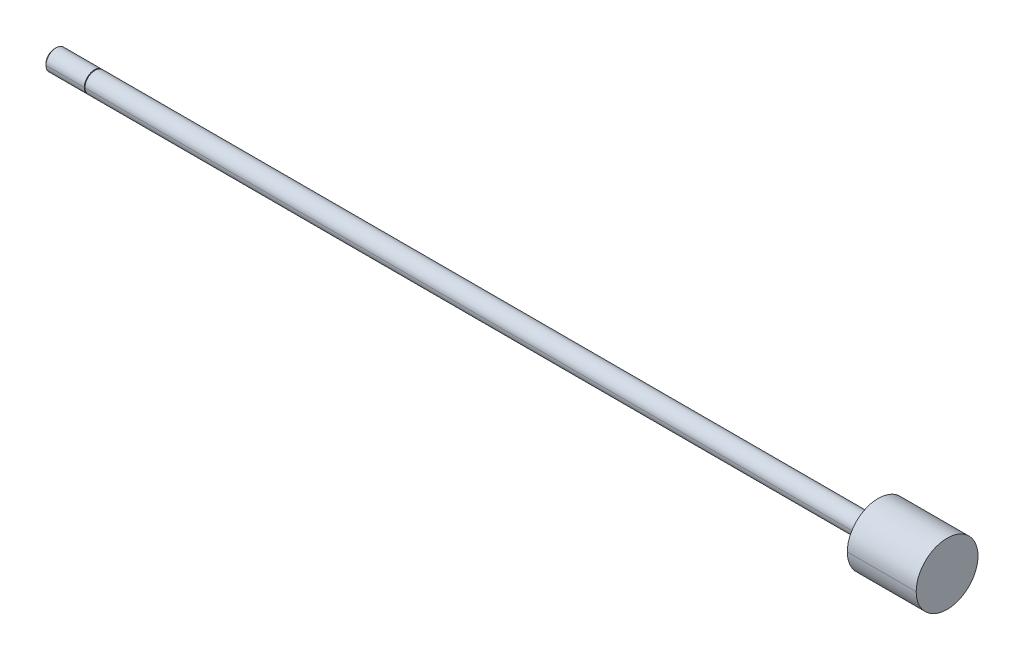
ISO-10303-21;
HEADER;
FILE_DESCRIPTION(('STEP AP214'),'2;1');
FILE_NAME('part.step','',(''),(''),'','','');
FILE_SCHEMA(('AUTOMOTIVE_DESIGN { 1 0 10303 214 1 1 1 1 }'));
ENDSEC;
DATA;
#1=APPLICATION_CONTEXT('core data for automotive mechanical design processes');
#2=APPLICATION_PROTOCOL_DEFINITION('international standard','automotive_design',2000,#1);
#3=PRODUCT_CONTEXT('',#1,'mechanical');
#4=PRODUCT('Part','Part','',(#3));
#5=PRODUCT_RELATED_PRODUCT_CATEGORY('part','',(#4));
#6=PRODUCT_DEFINITION_FORMATION('','',#4);
#7=PRODUCT_DEFINITION_CONTEXT('part definition',#1,'design');
#8=PRODUCT_DEFINITION('design','',#6,#7);
#9=PRODUCT_DEFINITION_SHAPE('','',#8);
#10=(LENGTH_UNIT() NAMED_UNIT(*) SI_UNIT(.MILLI.,.METRE.));
#11=(NAMED_UNIT(*) PLANE_ANGLE_UNIT() SI_UNIT($,.RADIAN.));
#12=(NAMED_UNIT(*) SI_UNIT($,.STERADIAN.) SOLID_ANGLE_UNIT());
#13=UNCERTAINTY_MEASURE_WITH_UNIT(LENGTH_MEASURE(1.E-05),#10,'distance_accuracy_value','');
#14=(GEOMETRIC_REPRESENTATION_CONTEXT(3) GLOBAL_UNCERTAINTY_ASSIGNED_CONTEXT((#13)) GLOBAL_UNIT_ASSIGNED_CONTEXT((#10,
#11,#12)) REPRESENTATION_CONTEXT('',''));
#15=CARTESIAN_POINT('',(0.,0.,0.));
#16=DIRECTION('',(0.,0.,1.));
#17=DIRECTION('',(1.,0.,0.));
#18=AXIS2_PLACEMENT_3D('',#15,#16,#17);
#19=CARTESIAN_POINT('',(0.,0.,0.));
#20=DIRECTION('',(-1.,0.,0.));
#21=DIRECTION('',(0.,-1.,0.));
#22=AXIS2_PLACEMENT_3D('',#19,#20,#21);
#23=CYLINDRICAL_SURFACE('',#22,2.921);
#24=CARTESIAN_POINT('',(0.,0.,0.));
#25=DIRECTION('',(1.,0.,0.));
#26=DIRECTION('',(0.,0.,-1.));
#27=AXIS2_PLACEMENT_3D('',#24,#25,#26);
#28=CIRCLE('',#27,2.921);
#29=CARTESIAN_POINT('',(0.,0.,-2.921));
#30=VERTEX_POINT('',#29);
#31=CARTESIAN_POINT('',(0.,0.,2.921));
#32=VERTEX_POINT('',#31);
#33=EDGE_CURVE('E11',#30,#32,#28,.T.);
#34=ORIENTED_EDGE('',*,*,#33,.F.);
#35=DIRECTION('',(-1.,0.,0.));
#36=VECTOR('',#35,1.);
#37=CARTESIAN_POINT('',(0.,0.,-2.921));
#38=LINE('',#37,#36);
#39=CARTESIAN_POINT('',(-0.254,0.,-2.921));
#40=VERTEX_POINT('',#39);
#41=EDGE_CURVE('E25',#30,#40,#38,.T.);
#42=ORIENTED_EDGE('',*,*,#41,.T.);
#43=CARTESIAN_POINT('',(-0.254,0.,0.));
#44=DIRECTION('',(1.,0.,0.));
#45=DIRECTION('',(0.,0.,-1.));
#46=AXIS2_PLACEMENT_3D('',#43,#44,#45);
#47=CIRCLE('',#46,2.921);
#48=CARTESIAN_POINT('',(-0.254,0.,2.921));
#49=VERTEX_POINT('',#48);
#50=EDGE_CURVE('E211',#40,#49,#47,.T.);
#51=ORIENTED_EDGE('',*,*,#50,.T.);
#52=DIRECTION('',(-1.,0.,0.));
#53=VECTOR('',#52,1.);
#54=CARTESIAN_POINT('',(0.,0.,2.921));
#55=LINE('',#54,#53);
#56=EDGE_CURVE('E206',#32,#49,#55,.T.);
#57=ORIENTED_EDGE('',*,*,#56,.F.);
#58=EDGE_LOOP('',(#34,#42,#51,#57));
#59=FACE_BOUND('',#58,.T.);
#60=ADVANCED_FACE('F17',(#59),#23,.T.);
#61=CARTESIAN_POINT('',(0.,0.,0.));
#62=DIRECTION('',(-1.,0.,0.));
#63=DIRECTION('',(0.,1.,0.));
#64=AXIS2_PLACEMENT_3D('',#61,#62,#63);
#65=CYLINDRICAL_SURFACE('',#64,2.921);
#66=CARTESIAN_POINT('',(-0.254,0.,0.));
#67=DIRECTION('',(1.,0.,0.));
#68=DIRECTION('',(0.,0.,-1.));
#69=AXIS2_PLACEMENT_3D('',#66,#67,#68);
#70=CIRCLE('',#69,2.921);
#71=EDGE_CURVE('E202',#49,#40,#70,.T.);
#72=ORIENTED_EDGE('',*,*,#71,.T.);
#73=ORIENTED_EDGE('',*,*,#41,.F.);
#74=CARTESIAN_POINT('',(0.,0.,0.));
#75=DIRECTION('',(1.,0.,0.));
#76=DIRECTION('',(0.,0.,-1.));
#77=AXIS2_PLACEMENT_3D('',#74,#75,#76);
#78=CIRCLE('',#77,2.921);
#79=EDGE_CURVE('E197',#32,#30,#78,.T.);
#80=ORIENTED_EDGE('',*,*,#79,.F.);
#81=ORIENTED_EDGE('',*,*,#56,.T.);
#82=EDGE_LOOP('',(#72,#73,#80,#81));
#83=FACE_BOUND('',#82,.T.);
#84=ADVANCED_FACE('F224',(#83),#65,.T.);
#85=CARTESIAN_POINT('',(0.,2.921,0.));
#86=DIRECTION('',(1.,0.,0.));
#87=DIRECTION('',(0.,0.,-1.));
#88=AXIS2_PLACEMENT_3D('',#85,#86,#87);
#89=PLANE('',#88);
#90=CARTESIAN_POINT('',(0.,0.,0.));
#91=DIRECTION('',(1.,0.,0.));
#92=DIRECTION('',(0.,0.,-1.));
#93=AXIS2_PLACEMENT_3D('',#90,#91,#92);
#94=CIRCLE('',#93,3.175);
#95=CARTESIAN_POINT('',(0.,0.,-3.175));
#96=VERTEX_POINT('',#95);
#97=CARTESIAN_POINT('',(0.,0.,3.175));
#98=VERTEX_POINT('',#97);
#99=EDGE_CURVE('E192',#96,#98,#94,.T.);
#100=ORIENTED_EDGE('',*,*,#99,.F.);
#101=CARTESIAN_POINT('',(0.,0.,0.));
#102=DIRECTION('',(1.,0.,0.));
#103=DIRECTION('',(0.,0.,-1.));
#104=AXIS2_PLACEMENT_3D('',#101,#102,#103);
#105=CIRCLE('',#104,3.175);
#106=EDGE_CURVE('E187',#98,#96,#105,.T.);
#107=ORIENTED_EDGE('',*,*,#106,.F.);
#108=EDGE_LOOP('',(#100,#107));
#109=FACE_BOUND('',#108,.T.);
#110=ORIENTED_EDGE('',*,*,#33,.T.);
#111=ORIENTED_EDGE('',*,*,#79,.T.);
#112=EDGE_LOOP('',(#110,#111));
#113=FACE_BOUND('',#112,.T.);
#114=ADVANCED_FACE('F249',(#109,#113),#89,.F.);
#115=CARTESIAN_POINT('',(265.1252,0.,0.));
#116=DIRECTION('',(-1.,0.,0.));
#117=DIRECTION('',(0.,1.,0.));
#118=AXIS2_PLACEMENT_3D('',#115,#116,#117);
#119=CYLINDRICAL_SURFACE('',#118,3.175);
#120=ORIENTED_EDGE('',*,*,#106,.T.);
#121=DIRECTION('',(-1.,0.,0.));
#122=VECTOR('',#121,1.);
#123=CARTESIAN_POINT('',(243.6876,0.,-3.175));
#124=LINE('',#123,#122);
#125=CARTESIAN_POINT('',(243.6876,0.,-3.175));
#126=VERTEX_POINT('',#125);
#127=EDGE_CURVE('E182',#126,#96,#124,.T.);
#128=ORIENTED_EDGE('',*,*,#127,.F.);
#129=CARTESIAN_POINT('',(243.6876,0.,0.));
#130=DIRECTION('',(1.,0.,0.));
#131=DIRECTION('',(0.,0.,-1.));
#132=AXIS2_PLACEMENT_3D('',#129,#130,#131);
#133=CIRCLE('',#132,3.175);
#134=CARTESIAN_POINT('',(243.6876,0.,3.175));
#135=VERTEX_POINT('',#134);
#136=EDGE_CURVE('E177',#135,#126,#133,.T.);
#137=ORIENTED_EDGE('',*,*,#136,.F.);
#138=DIRECTION('',(-1.,0.,0.));
#139=VECTOR('',#138,1.);
#140=CARTESIAN_POINT('',(243.6876,0.,3.175));
#141=LINE('',#140,#139);
#142=EDGE_CURVE('E172',#135,#98,#141,.T.);
#143=ORIENTED_EDGE('',*,*,#142,.T.);
#144=EDGE_LOOP('',(#120,#128,#137,#143));
#145=FACE_BOUND('',#144,.T.);
#146=ADVANCED_FACE('F253',(#145),#119,.T.);
#147=CARTESIAN_POINT('',(265.1252,0.,0.));
#148=DIRECTION('',(-1.,0.,0.));
#149=DIRECTION('',(0.,-1.,0.));
#150=AXIS2_PLACEMENT_3D('',#147,#148,#149);
#151=CYLINDRICAL_SURFACE('',#150,3.175);
#152=CARTESIAN_POINT('',(243.6876,0.,0.));
#153=DIRECTION('',(1.,0.,0.));
#154=DIRECTION('',(0.,0.,-1.));
#155=AXIS2_PLACEMENT_3D('',#152,#153,#154);
#156=CIRCLE('',#155,3.175);
#157=EDGE_CURVE('E167',#126,#135,#156,.T.);
#158=ORIENTED_EDGE('',*,*,#157,.F.);
#159=ORIENTED_EDGE('',*,*,#127,.T.);
#160=ORIENTED_EDGE('',*,*,#99,.T.);
#161=ORIENTED_EDGE('',*,*,#142,.F.);
#162=EDGE_LOOP('',(#158,#159,#160,#161));
#163=FACE_BOUND('',#162,.T.);
#164=ADVANCED_FACE('F259',(#163),#151,.T.);
#165=CARTESIAN_POINT('',(243.6876,3.175,0.));
#166=DIRECTION('',(1.,0.,0.));
#167=DIRECTION('',(0.,0.,-1.));
#168=AXIS2_PLACEMENT_3D('',#165,#166,#167);
#169=PLANE('',#168);
#170=CARTESIAN_POINT('',(243.6876,0.,0.));
#171=DIRECTION('',(1.,0.,0.));
#172=DIRECTION('',(0.,0.,-1.));
#173=AXIS2_PLACEMENT_3D('',#170,#171,#172);
#174=CIRCLE('',#173,9.62025);
#175=CARTESIAN_POINT('',(243.6876,0.,-9.62025));
#176=VERTEX_POINT('',#175);
#177=CARTESIAN_POINT('',(243.6876,0.,9.62025));
#178=VERTEX_POINT('',#177);
#179=EDGE_CURVE('E162',#176,#178,#174,.T.);
#180=ORIENTED_EDGE('',*,*,#179,.F.);
#181=CARTESIAN_POINT('',(243.6876,0.,0.));
#182=DIRECTION('',(1.,0.,0.));
#183=DIRECTION('',(0.,0.,-1.));
#184=AXIS2_PLACEMENT_3D('',#181,#182,#183);
#185=CIRCLE('',#184,9.62025);
#186=EDGE_CURVE('E157',#178,#176,#185,.T.);
#187=ORIENTED_EDGE('',*,*,#186,.F.);
#188=EDGE_LOOP('',(#180,#187));
#189=FACE_BOUND('',#188,.T.);
#190=ORIENTED_EDGE('',*,*,#157,.T.);
#191=ORIENTED_EDGE('',*,*,#136,.T.);
#192=EDGE_LOOP('',(#190,#191));
#193=FACE_BOUND('',#192,.T.);
#194=ADVANCED_FACE('F263',(#189,#193),#169,.F.);
#195=CARTESIAN_POINT('',(265.1252,0.,0.));
#196=DIRECTION('',(-1.,0.,0.));
#197=DIRECTION('',(0.,1.,0.));
#198=AXIS2_PLACEMENT_3D('',#195,#196,#197);
#199=CYLINDRICAL_SURFACE('',#198,9.62025);
#200=ORIENTED_EDGE('',*,*,#186,.T.);
#201=DIRECTION('',(-1.,0.,0.));
#202=VECTOR('',#201,1.);
#203=CARTESIAN_POINT('',(265.1252,0.,-9.62025));
#204=LINE('',#203,#202);
#205=CARTESIAN_POINT('',(265.1252,0.,-9.62025));
#206=VERTEX_POINT('',#205);
#207=EDGE_CURVE('E152',#206,#176,#204,.T.);
#208=ORIENTED_EDGE('',*,*,#207,.F.);
#209=CARTESIAN_POINT('',(265.1252,0.,0.));
#210=DIRECTION('',(1.,0.,0.));
#211=DIRECTION('',(0.,0.,-1.));
#212=AXIS2_PLACEMENT_3D('',#209,#210,#211);
#213=CIRCLE('',#212,9.62025);
#214=CARTESIAN_POINT('',(265.1252,0.,9.62025));
#215=VERTEX_POINT('',#214);
#216=EDGE_CURVE('E147',#215,#206,#213,.T.);
#217=ORIENTED_EDGE('',*,*,#216,.F.);
#218=DIRECTION('',(-1.,0.,0.));
#219=VECTOR('',#218,1.);
#220=CARTESIAN_POINT('',(265.1252,0.,9.62025));
#221=LINE('',#220,#219);
#222=EDGE_CURVE('E142',#215,#178,#221,.T.);
#223=ORIENTED_EDGE('',*,*,#222,.T.);
#224=EDGE_LOOP('',(#200,#208,#217,#223));
#225=FACE_BOUND('',#224,.T.);
#226=ADVANCED_FACE('F267',(#225),#199,.T.);
#227=CARTESIAN_POINT('',(265.1252,0.,0.));
#228=DIRECTION('',(-1.,0.,0.));
#229=DIRECTION('',(0.,-1.,0.));
#230=AXIS2_PLACEMENT_3D('',#227,#228,#229);
#231=CYLINDRICAL_SURFACE('',#230,9.62025);
#232=CARTESIAN_POINT('',(265.1252,0.,0.));
#233=DIRECTION('',(1.,0.,0.));
#234=DIRECTION('',(0.,0.,-1.));
#235=AXIS2_PLACEMENT_3D('',#232,#233,#234);
#236=CIRCLE('',#235,9.62025);
#237=EDGE_CURVE('E137',#206,#215,#236,.T.);
#238=ORIENTED_EDGE('',*,*,#237,.F.);
#239=ORIENTED_EDGE('',*,*,#207,.T.);
#240=ORIENTED_EDGE('',*,*,#179,.T.);
#241=ORIENTED_EDGE('',*,*,#222,.F.);
#242=EDGE_LOOP('',(#238,#239,#240,#241));
#243=FACE_BOUND('',#242,.T.);
#244=ADVANCED_FACE('F271',(#243),#231,.T.);
#245=CARTESIAN_POINT('',(265.1252,9.62025,0.));
#246=DIRECTION('',(-1.,0.,0.));
#247=DIRECTION('',(0.,0.,1.));
#248=AXIS2_PLACEMENT_3D('',#245,#246,#247);
#249=PLANE('',#248);
#250=ORIENTED_EDGE('',*,*,#237,.T.);
#251=ORIENTED_EDGE('',*,*,#216,.T.);
#252=EDGE_LOOP('',(#250,#251));
#253=FACE_BOUND('',#252,.T.);
#254=ADVANCED_FACE('F229',(#253),#249,.F.);
#255=CARTESIAN_POINT('',(-0.254,3.429,0.));
#256=DIRECTION('',(-1.,0.,0.));
#257=DIRECTION('',(0.,0.,1.));
#258=AXIS2_PLACEMENT_3D('',#255,#256,#257);
#259=PLANE('',#258);
#260=ORIENTED_EDGE('',*,*,#50,.F.);
#261=ORIENTED_EDGE('',*,*,#71,.F.);
#262=EDGE_LOOP('',(#260,#261));
#263=FACE_BOUND('',#262,.T.);
#264=CARTESIAN_POINT('',(-0.253999999999976,0.,0.));
#265=DIRECTION('',(-1.,0.,0.));
#266=DIRECTION('',(0.,0.,1.));
#267=AXIS2_PLACEMENT_3D('',#264,#265,#266);
#268=CIRCLE('',#267,3.175);
#269=CARTESIAN_POINT('',(-0.253999999999976,0.,3.175));
#270=VERTEX_POINT('',#269);
#271=CARTESIAN_POINT('',(-0.253999999999962,0.,-3.175));
#272=VERTEX_POINT('',#271);
#273=EDGE_CURVE('E132',#270,#272,#268,.T.);
#274=ORIENTED_EDGE('',*,*,#273,.F.);
#275=CARTESIAN_POINT('',(-0.253999999999976,0.,0.));
#276=DIRECTION('',(-1.,0.,0.));
#277=DIRECTION('',(0.,0.,1.));
#278=AXIS2_PLACEMENT_3D('',#275,#276,#277);
#279=CIRCLE('',#278,3.175);
#280=EDGE_CURVE('E127',#272,#270,#279,.T.);
#281=ORIENTED_EDGE('',*,*,#280,.F.);
#282=EDGE_LOOP('',(#274,#281));
#283=FACE_BOUND('',#282,.T.);
#284=ADVANCED_FACE('F225',(#263,#283),#259,.F.);
#285=CARTESIAN_POINT('',(265.1252,0.,0.));
#286=DIRECTION('',(-1.,0.,0.));
#287=DIRECTION('',(0.,1.,0.));
#288=AXIS2_PLACEMENT_3D('',#285,#286,#287);
#289=CYLINDRICAL_SURFACE('',#288,3.175);
#290=CARTESIAN_POINT('',(-12.15898,0.,0.));
#291=DIRECTION('',(1.,0.,0.));
#292=DIRECTION('',(0.,0.,-1.));
#293=AXIS2_PLACEMENT_3D('',#290,#291,#292);
#294=CIRCLE('',#293,3.175);
#295=CARTESIAN_POINT('',(-12.15898,0.,3.175));
#296=VERTEX_POINT('',#295);
#297=CARTESIAN_POINT('',(-12.15898,0.,-3.175));
#298=VERTEX_POINT('',#297);
#299=EDGE_CURVE('E98',#296,#298,#294,.T.);
#300=ORIENTED_EDGE('',*,*,#299,.T.);
#301=DIRECTION('',(-1.,0.,0.));
#302=VECTOR('',#301,1.);
#303=CARTESIAN_POINT('',(-0.253999999999962,0.,-3.175));
#304=LINE('',#303,#302);
#305=EDGE_CURVE('E119',#272,#298,#304,.T.);
#306=ORIENTED_EDGE('',*,*,#305,.F.);
#307=ORIENTED_EDGE('',*,*,#280,.T.);
#308=DIRECTION('',(-1.,0.,0.));
#309=VECTOR('',#308,1.);
#310=CARTESIAN_POINT('',(-0.253999999999962,0.,3.175));
#311=LINE('',#310,#309);
#312=EDGE_CURVE('E115',#270,#296,#311,.T.);
#313=ORIENTED_EDGE('',*,*,#312,.T.);
#314=EDGE_LOOP('',(#300,#306,#307,#313));
#315=FACE_BOUND('',#314,.T.);
#316=ADVANCED_FACE('F228',(#315),#289,.T.);
#317=CARTESIAN_POINT('',(265.1252,0.,0.));
#318=DIRECTION('',(-1.,0.,0.));
#319=DIRECTION('',(0.,-1.,0.));
#320=AXIS2_PLACEMENT_3D('',#317,#318,#319);
#321=CYLINDRICAL_SURFACE('',#320,3.175);
#322=ORIENTED_EDGE('',*,*,#273,.T.);
#323=ORIENTED_EDGE('',*,*,#305,.T.);
#324=CARTESIAN_POINT('',(-12.15898,0.,0.));
#325=DIRECTION('',(1.,0.,0.));
#326=DIRECTION('',(0.,0.,-1.));
#327=AXIS2_PLACEMENT_3D('',#324,#325,#326);
#328=CIRCLE('',#327,3.175);
#329=EDGE_CURVE('E110',#298,#296,#328,.T.);
#330=ORIENTED_EDGE('',*,*,#329,.T.);
#331=ORIENTED_EDGE('',*,*,#312,.F.);
#332=EDGE_LOOP('',(#322,#323,#330,#331));
#333=FACE_BOUND('',#332,.T.);
#334=ADVANCED_FACE('F235',(#333),#321,.T.);
#335=CARTESIAN_POINT('',(-12.7,0.,0.));
#336=DIRECTION('',(1.,0.,0.));
#337=DIRECTION('',(0.,-1.,0.));
#338=AXIS2_PLACEMENT_3D('',#335,#336,#337);
#339=CONICAL_SURFACE('',#338,2.63398,0.7853981634);
#340=ORIENTED_EDGE('',*,*,#329,.F.);
#341=DIRECTION('',(0.707106781184742,0.,-0.707106781188353));
#342=VECTOR('',#341,1.);
#343=CARTESIAN_POINT('',(-12.7,0.,-2.63398));
#344=LINE('',#343,#342);
#345=CARTESIAN_POINT('',(-12.7,0.,-2.63398));
#346=VERTEX_POINT('',#345);
#347=EDGE_CURVE('E90',#346,#298,#344,.T.);
#348=ORIENTED_EDGE('',*,*,#347,.F.);
#349=CARTESIAN_POINT('',(-12.7,0.,0.));
#350=DIRECTION('',(1.,0.,0.));
#351=DIRECTION('',(0.,0.,-1.));
#352=AXIS2_PLACEMENT_3D('',#349,#350,#351);
#353=CIRCLE('',#352,2.63398);
#354=CARTESIAN_POINT('',(-12.7,0.,2.63398));
#355=VERTEX_POINT('',#354);
#356=EDGE_CURVE('E83',#346,#355,#353,.T.);
#357=ORIENTED_EDGE('',*,*,#356,.T.);
#358=DIRECTION('',(0.707106781184742,0.,0.707106781188353));
#359=VECTOR('',#358,1.);
#360=CARTESIAN_POINT('',(-12.7,0.,2.63398));
#361=LINE('',#360,#359);
#362=EDGE_CURVE('E87',#355,#296,#361,.T.);
#363=ORIENTED_EDGE('',*,*,#362,.T.);
#364=EDGE_LOOP('',(#340,#348,#357,#363));
#365=FACE_BOUND('',#364,.T.);
#366=ADVANCED_FACE('F86',(#365),#339,.T.);
#367=CARTESIAN_POINT('',(-12.7,0.,0.));
#368=DIRECTION('',(1.,0.,0.));
#369=DIRECTION('',(0.,1.,0.));
#370=AXIS2_PLACEMENT_3D('',#367,#368,#369);
#371=CONICAL_SURFACE('',#370,2.63398,0.7853981634);
#372=CARTESIAN_POINT('',(-12.7,0.,0.));
#373=DIRECTION('',(1.,0.,0.));
#374=DIRECTION('',(0.,0.,-1.));
#375=AXIS2_PLACEMENT_3D('',#372,#373,#374);
#376=CIRCLE('',#375,2.63398);
#377=EDGE_CURVE('E97',#355,#346,#376,.T.);
#378=ORIENTED_EDGE('',*,*,#377,.T.);
#379=ORIENTED_EDGE('',*,*,#347,.T.);
#380=ORIENTED_EDGE('',*,*,#299,.F.);
#381=ORIENTED_EDGE('',*,*,#362,.F.);
#382=EDGE_LOOP('',(#378,#379,#380,#381));
#383=FACE_BOUND('',#382,.T.);
#384=ADVANCED_FACE('F96',(#383),#371,.T.);
#385=CARTESIAN_POINT('',(-12.7,0.,0.));
#386=DIRECTION('',(1.,0.,0.));
#387=DIRECTION('',(0.,0.,-1.));
#388=AXIS2_PLACEMENT_3D('',#385,#386,#387);
#389=PLANE('',#388);
#390=ORIENTED_EDGE('',*,*,#356,.F.);
#391=ORIENTED_EDGE('',*,*,#377,.F.);
#392=EDGE_LOOP('',(#390,#391));
#393=FACE_BOUND('',#392,.T.);
#394=ADVANCED_FACE('F100',(#393),#389,.F.);
#395=CLOSED_SHELL('',(#60,#84,#114,#146,#164,#194,#226,#244,#254,#284,#316,#334,#366,#384,#394));
#396=MANIFOLD_SOLID_BREP('B1',#395);
#397=ADVANCED_BREP_SHAPE_REPRESENTATION('',(#18,#396),#14);
#398=SHAPE_DEFINITION_REPRESENTATION(#9,#397);
ENDSEC;
END-ISO-10303-21;
